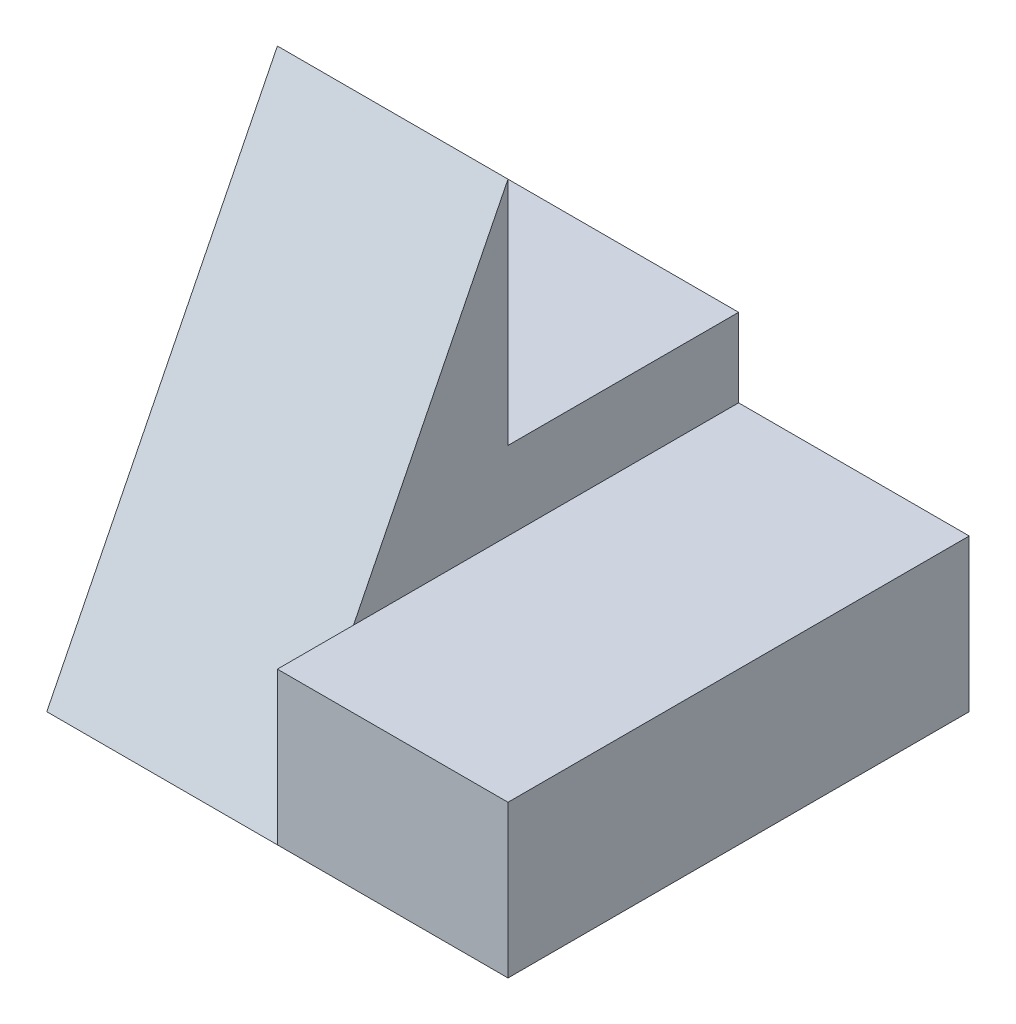
ISO-10303-21;
HEADER;
FILE_DESCRIPTION(('STEP AP214'),'2;1');
FILE_NAME('part.step','',(''),(''),'','','');
FILE_SCHEMA(('AUTOMOTIVE_DESIGN { 1 0 10303 214 1 1 1 1 }'));
ENDSEC;
DATA;
#1=APPLICATION_CONTEXT('core data for automotive mechanical design processes');
#2=APPLICATION_PROTOCOL_DEFINITION('international standard','automotive_design',2000,#1);
#3=PRODUCT_CONTEXT('',#1,'mechanical');
#4=PRODUCT('Part','Part','',(#3));
#5=PRODUCT_RELATED_PRODUCT_CATEGORY('part','',(#4));
#6=PRODUCT_DEFINITION_FORMATION('','',#4);
#7=PRODUCT_DEFINITION_CONTEXT('part definition',#1,'design');
#8=PRODUCT_DEFINITION('design','',#6,#7);
#9=PRODUCT_DEFINITION_SHAPE('','',#8);
#10=(LENGTH_UNIT() NAMED_UNIT(*) SI_UNIT(.MILLI.,.METRE.));
#11=(NAMED_UNIT(*) PLANE_ANGLE_UNIT() SI_UNIT($,.RADIAN.));
#12=(NAMED_UNIT(*) SI_UNIT($,.STERADIAN.) SOLID_ANGLE_UNIT());
#13=UNCERTAINTY_MEASURE_WITH_UNIT(LENGTH_MEASURE(1.E-05),#10,'distance_accuracy_value','');
#14=(GEOMETRIC_REPRESENTATION_CONTEXT(3) GLOBAL_UNCERTAINTY_ASSIGNED_CONTEXT((#13)) GLOBAL_UNIT_ASSIGNED_CONTEXT((#10,
#11,#12)) REPRESENTATION_CONTEXT('',''));
#15=CARTESIAN_POINT('',(0.,0.,0.));
#16=DIRECTION('',(0.,0.,1.));
#17=DIRECTION('',(1.,0.,0.));
#18=AXIS2_PLACEMENT_3D('',#15,#16,#17);
#19=CARTESIAN_POINT('',(0.5,1.,0.));
#20=DIRECTION('',(1.,0.,0.));
#21=DIRECTION('',(0.,0.,-1.));
#22=AXIS2_PLACEMENT_3D('',#19,#20,#21);
#23=PLANE('',#22);
#24=DIRECTION('',(0.,0.,1.));
#25=VECTOR('',#24,1.);
#26=CARTESIAN_POINT('',(0.5,0.33,0.));
#27=LINE('',#26,#25);
#28=CARTESIAN_POINT('',(0.5,0.33,-0.165));
#29=VERTEX_POINT('',#28);
#30=CARTESIAN_POINT('',(0.5,0.33,0.));
#31=VERTEX_POINT('',#30);
#32=EDGE_CURVE('E149',#29,#31,#27,.T.);
#33=ORIENTED_EDGE('',*,*,#32,.F.);
#34=DIRECTION('',(0.,-0.894427190999916,0.447213595499958));
#35=VECTOR('',#34,1.);
#36=CARTESIAN_POINT('',(0.5,0.,0.));
#37=LINE('',#36,#35);
#38=CARTESIAN_POINT('',(0.5,0.,0.));
#39=VERTEX_POINT('',#38);
#40=EDGE_CURVE('E55',#29,#39,#37,.T.);
#41=ORIENTED_EDGE('',*,*,#40,.T.);
#42=DIRECTION('',(0.,-1.,0.));
#43=VECTOR('',#42,1.);
#44=CARTESIAN_POINT('',(0.5,1.,0.));
#45=LINE('',#44,#43);
#46=EDGE_CURVE('E126',#31,#39,#45,.T.);
#47=ORIENTED_EDGE('',*,*,#46,.F.);
#48=EDGE_LOOP('',(#33,#41,#47));
#49=FACE_BOUND('',#48,.T.);
#50=ADVANCED_FACE('F39',(#49),#23,.F.);
#51=CARTESIAN_POINT('',(-2.7900635094611,0.5,-0.5));
#52=DIRECTION('',(0.,-1.,0.));
#53=DIRECTION('',(0.,0.,-1.));
#54=AXIS2_PLACEMENT_3D('',#51,#52,#53);
#55=PLANE('',#54);
#56=DIRECTION('',(0.,0.,1.));
#57=VECTOR('',#56,1.);
#58=CARTESIAN_POINT('',(0.,0.5,-0.5));
#59=LINE('',#58,#57);
#60=CARTESIAN_POINT('',(0.,0.5,-1.));
#61=VERTEX_POINT('',#60);
#62=CARTESIAN_POINT('',(0.,0.5,-0.5));
#63=VERTEX_POINT('',#62);
#64=EDGE_CURVE('E122',#61,#63,#59,.T.);
#65=ORIENTED_EDGE('',*,*,#64,.T.);
#66=DIRECTION('',(1.,0.,0.));
#67=VECTOR('',#66,1.);
#68=CARTESIAN_POINT('',(-2.7900635094611,0.5,-0.5));
#69=LINE('',#68,#67);
#70=CARTESIAN_POINT('',(0.5,0.5,-0.5));
#71=VERTEX_POINT('',#70);
#72=EDGE_CURVE('E107',#63,#71,#69,.T.);
#73=ORIENTED_EDGE('',*,*,#72,.T.);
#74=DIRECTION('',(0.,0.,1.));
#75=VECTOR('',#74,1.);
#76=CARTESIAN_POINT('',(0.5,0.5,-0.5));
#77=LINE('',#76,#75);
#78=CARTESIAN_POINT('',(0.5,0.5,-1.));
#79=VERTEX_POINT('',#78);
#80=EDGE_CURVE('E138',#79,#71,#77,.T.);
#81=ORIENTED_EDGE('',*,*,#80,.F.);
#82=DIRECTION('',(1.,0.,0.));
#83=VECTOR('',#82,1.);
#84=CARTESIAN_POINT('',(-2.7900635094611,0.5,-1.));
#85=LINE('',#84,#83);
#86=EDGE_CURVE('E120',#61,#79,#85,.T.);
#87=ORIENTED_EDGE('',*,*,#86,.F.);
#88=EDGE_LOOP('',(#65,#73,#81,#87));
#89=FACE_BOUND('',#88,.T.);
#90=ADVANCED_FACE('F123',(#89),#55,.F.);
#91=CARTESIAN_POINT('',(-2.7900635094611,1.,-0.5));
#92=DIRECTION('',(0.,0.,1.));
#93=DIRECTION('',(1.,0.,0.));
#94=AXIS2_PLACEMENT_3D('',#91,#92,#93);
#95=PLANE('',#94);
#96=DIRECTION('',(0.,1.,0.));
#97=VECTOR('',#96,1.);
#98=CARTESIAN_POINT('',(0.,1.,-0.5));
#99=LINE('',#98,#97);
#100=CARTESIAN_POINT('',(0.,1.,-0.5));
#101=VERTEX_POINT('',#100);
#102=EDGE_CURVE('E112',#63,#101,#99,.T.);
#103=ORIENTED_EDGE('',*,*,#102,.T.);
#104=DIRECTION('',(1.,0.,0.));
#105=VECTOR('',#104,1.);
#106=CARTESIAN_POINT('',(-2.7900635094611,1.,-0.5));
#107=LINE('',#106,#105);
#108=CARTESIAN_POINT('',(0.5,1.,-0.5));
#109=VERTEX_POINT('',#108);
#110=EDGE_CURVE('E135',#101,#109,#107,.T.);
#111=ORIENTED_EDGE('',*,*,#110,.T.);
#112=DIRECTION('',(0.,1.,0.));
#113=VECTOR('',#112,1.);
#114=CARTESIAN_POINT('',(0.5,1.,-0.5));
#115=LINE('',#114,#113);
#116=EDGE_CURVE('E115',#71,#109,#115,.T.);
#117=ORIENTED_EDGE('',*,*,#116,.F.);
#118=ORIENTED_EDGE('',*,*,#72,.F.);
#119=EDGE_LOOP('',(#103,#111,#117,#118));
#120=FACE_BOUND('',#119,.T.);
#121=ADVANCED_FACE('F109',(#120),#95,.F.);
#122=CARTESIAN_POINT('',(-2.7900635094611,0.,0.));
#123=DIRECTION('',(0.,-0.447213595499958,-0.894427190999916));
#124=DIRECTION('',(0.,0.894427190999916,-0.447213595499958));
#125=AXIS2_PLACEMENT_3D('',#122,#123,#124);
#126=PLANE('',#125);
#127=DIRECTION('',(0.,-0.894427190999916,0.447213595499958));
#128=VECTOR('',#127,1.);
#129=CARTESIAN_POINT('',(0.,0.,0.));
#130=LINE('',#129,#128);
#131=CARTESIAN_POINT('',(0.,0.,0.));
#132=VERTEX_POINT('',#131);
#133=EDGE_CURVE('E128',#101,#132,#130,.T.);
#134=ORIENTED_EDGE('',*,*,#133,.T.);
#135=DIRECTION('',(1.,0.,0.));
#136=VECTOR('',#135,1.);
#137=CARTESIAN_POINT('',(0.,0.,0.));
#138=LINE('',#137,#136);
#139=EDGE_CURVE('E167',#132,#39,#138,.T.);
#140=ORIENTED_EDGE('',*,*,#139,.T.);
#141=ORIENTED_EDGE('',*,*,#40,.F.);
#142=EDGE_CURVE('E207',#109,#29,#37,.T.);
#143=ORIENTED_EDGE('',*,*,#142,.F.);
#144=ORIENTED_EDGE('',*,*,#110,.F.);
#145=EDGE_LOOP('',(#134,#140,#141,#143,#144));
#146=FACE_BOUND('',#145,.T.);
#147=ADVANCED_FACE('F193',(#146),#126,.F.);
#148=CARTESIAN_POINT('',(0.,1.,0.));
#149=DIRECTION('',(0.,0.,-1.));
#150=DIRECTION('',(-1.,0.,0.));
#151=AXIS2_PLACEMENT_3D('',#148,#149,#150);
#152=PLANE('',#151);
#153=DIRECTION('',(-1.,0.,0.));
#154=VECTOR('',#153,1.);
#155=CARTESIAN_POINT('',(4.4150635094611,0.33,0.));
#156=LINE('',#155,#154);
#157=CARTESIAN_POINT('',(1.,0.33,0.));
#158=VERTEX_POINT('',#157);
#159=EDGE_CURVE('E157',#158,#31,#156,.T.);
#160=ORIENTED_EDGE('',*,*,#159,.T.);
#161=ORIENTED_EDGE('',*,*,#46,.T.);
#162=CARTESIAN_POINT('',(1.,0.,0.));
#163=VERTEX_POINT('',#162);
#164=EDGE_CURVE('E166',#39,#163,#138,.T.);
#165=ORIENTED_EDGE('',*,*,#164,.T.);
#166=DIRECTION('',(0.,-1.,0.));
#167=VECTOR('',#166,1.);
#168=CARTESIAN_POINT('',(1.,1.,0.));
#169=LINE('',#168,#167);
#170=EDGE_CURVE('E11',#158,#163,#169,.T.);
#171=ORIENTED_EDGE('',*,*,#170,.F.);
#172=EDGE_LOOP('',(#160,#161,#165,#171));
#173=FACE_BOUND('',#172,.T.);
#174=ADVANCED_FACE('F195',(#173),#152,.F.);
#175=CARTESIAN_POINT('',(1.,1.,0.));
#176=DIRECTION('',(-1.,0.,0.));
#177=DIRECTION('',(0.,0.,1.));
#178=AXIS2_PLACEMENT_3D('',#175,#176,#177);
#179=PLANE('',#178);
#180=DIRECTION('',(0.,0.,1.));
#181=VECTOR('',#180,1.);
#182=CARTESIAN_POINT('',(1.,0.33,0.));
#183=LINE('',#182,#181);
#184=CARTESIAN_POINT('',(1.,0.33,-1.));
#185=VERTEX_POINT('',#184);
#186=EDGE_CURVE('E150',#185,#158,#183,.T.);
#187=ORIENTED_EDGE('',*,*,#186,.T.);
#188=ORIENTED_EDGE('',*,*,#170,.T.);
#189=DIRECTION('',(0.,0.,-1.));
#190=VECTOR('',#189,1.);
#191=CARTESIAN_POINT('',(1.,0.,0.));
#192=LINE('',#191,#190);
#193=CARTESIAN_POINT('',(1.,0.,-1.));
#194=VERTEX_POINT('',#193);
#195=EDGE_CURVE('E170',#163,#194,#192,.T.);
#196=ORIENTED_EDGE('',*,*,#195,.T.);
#197=DIRECTION('',(0.,-1.,0.));
#198=VECTOR('',#197,1.);
#199=CARTESIAN_POINT('',(1.,1.,-1.));
#200=LINE('',#199,#198);
#201=EDGE_CURVE('E48',#185,#194,#200,.T.);
#202=ORIENTED_EDGE('',*,*,#201,.F.);
#203=EDGE_LOOP('',(#187,#188,#196,#202));
#204=FACE_BOUND('',#203,.T.);
#205=ADVANCED_FACE('F187',(#204),#179,.F.);
#206=CARTESIAN_POINT('',(0.,1.,-1.));
#207=DIRECTION('',(0.,0.,1.));
#208=DIRECTION('',(1.,0.,0.));
#209=AXIS2_PLACEMENT_3D('',#206,#207,#208);
#210=PLANE('',#209);
#211=DIRECTION('',(0.,-1.,0.));
#212=VECTOR('',#211,1.);
#213=CARTESIAN_POINT('',(0.,1.,-1.));
#214=LINE('',#213,#212);
#215=CARTESIAN_POINT('',(0.,0.,-1.));
#216=VERTEX_POINT('',#215);
#217=EDGE_CURVE('E63',#61,#216,#214,.T.);
#218=ORIENTED_EDGE('',*,*,#217,.F.);
#219=ORIENTED_EDGE('',*,*,#86,.T.);
#220=DIRECTION('',(0.,-1.,0.));
#221=VECTOR('',#220,1.);
#222=CARTESIAN_POINT('',(0.5,1.,-1.));
#223=LINE('',#222,#221);
#224=CARTESIAN_POINT('',(0.5,0.33,-1.));
#225=VERTEX_POINT('',#224);
#226=EDGE_CURVE('E119',#79,#225,#223,.T.);
#227=ORIENTED_EDGE('',*,*,#226,.T.);
#228=DIRECTION('',(-1.,0.,0.));
#229=VECTOR('',#228,1.);
#230=CARTESIAN_POINT('',(4.4150635094611,0.33,-1.));
#231=LINE('',#230,#229);
#232=EDGE_CURVE('E148',#185,#225,#231,.T.);
#233=ORIENTED_EDGE('',*,*,#232,.F.);
#234=ORIENTED_EDGE('',*,*,#201,.T.);
#235=DIRECTION('',(-1.,0.,0.));
#236=VECTOR('',#235,1.);
#237=CARTESIAN_POINT('',(0.,0.,-1.));
#238=LINE('',#237,#236);
#239=EDGE_CURVE('E174',#194,#216,#238,.T.);
#240=ORIENTED_EDGE('',*,*,#239,.T.);
#241=EDGE_LOOP('',(#218,#219,#227,#233,#234,#240));
#242=FACE_BOUND('',#241,.T.);
#243=ADVANCED_FACE('F182',(#242),#210,.F.);
#244=CARTESIAN_POINT('',(0.,1.,0.));
#245=DIRECTION('',(1.,0.,0.));
#246=DIRECTION('',(0.,0.,-1.));
#247=AXIS2_PLACEMENT_3D('',#244,#245,#246);
#248=PLANE('',#247);
#249=ORIENTED_EDGE('',*,*,#102,.F.);
#250=ORIENTED_EDGE('',*,*,#64,.F.);
#251=ORIENTED_EDGE('',*,*,#217,.T.);
#252=DIRECTION('',(0.,0.,1.));
#253=VECTOR('',#252,1.);
#254=CARTESIAN_POINT('',(0.,0.,0.));
#255=LINE('',#254,#253);
#256=EDGE_CURVE('E161',#216,#132,#255,.T.);
#257=ORIENTED_EDGE('',*,*,#256,.T.);
#258=ORIENTED_EDGE('',*,*,#133,.F.);
#259=EDGE_LOOP('',(#249,#250,#251,#257,#258));
#260=FACE_BOUND('',#259,.T.);
#261=ADVANCED_FACE('F41',(#260),#248,.F.);
#262=CARTESIAN_POINT('',(0.,0.,0.));
#263=DIRECTION('',(0.,-1.,0.));
#264=DIRECTION('',(0.,0.,-1.));
#265=AXIS2_PLACEMENT_3D('',#262,#263,#264);
#266=PLANE('',#265);
#267=ORIENTED_EDGE('',*,*,#256,.F.);
#268=ORIENTED_EDGE('',*,*,#239,.F.);
#269=ORIENTED_EDGE('',*,*,#195,.F.);
#270=ORIENTED_EDGE('',*,*,#164,.F.);
#271=ORIENTED_EDGE('',*,*,#139,.F.);
#272=EDGE_LOOP('',(#267,#268,#269,#270,#271));
#273=FACE_BOUND('',#272,.T.);
#274=ADVANCED_FACE('F191',(#273),#266,.T.);
#275=CARTESIAN_POINT('',(4.4150635094611,0.33,0.));
#276=DIRECTION('',(0.,1.,0.));
#277=DIRECTION('',(0.,0.,1.));
#278=AXIS2_PLACEMENT_3D('',#275,#276,#277);
#279=PLANE('',#278);
#280=ORIENTED_EDGE('',*,*,#186,.F.);
#281=ORIENTED_EDGE('',*,*,#232,.T.);
#282=EDGE_CURVE('E144',#225,#29,#27,.T.);
#283=ORIENTED_EDGE('',*,*,#282,.T.);
#284=ORIENTED_EDGE('',*,*,#32,.T.);
#285=ORIENTED_EDGE('',*,*,#159,.F.);
#286=EDGE_LOOP('',(#280,#281,#283,#284,#285));
#287=FACE_BOUND('',#286,.T.);
#288=ADVANCED_FACE('F200',(#287),#279,.T.);
#289=CARTESIAN_POINT('',(0.5,1.,0.));
#290=DIRECTION('',(-1.,0.,0.));
#291=DIRECTION('',(0.,0.,1.));
#292=AXIS2_PLACEMENT_3D('',#289,#290,#291);
#293=PLANE('',#292);
#294=ORIENTED_EDGE('',*,*,#226,.F.);
#295=ORIENTED_EDGE('',*,*,#80,.T.);
#296=ORIENTED_EDGE('',*,*,#116,.T.);
#297=ORIENTED_EDGE('',*,*,#142,.T.);
#298=ORIENTED_EDGE('',*,*,#282,.F.);
#299=EDGE_LOOP('',(#294,#295,#296,#297,#298));
#300=FACE_BOUND('',#299,.T.);
#301=ADVANCED_FACE('F212',(#300),#293,.F.);
#302=CLOSED_SHELL('',(#50,#90,#121,#147,#174,#205,#243,#261,#274,#288,#301));
#303=MANIFOLD_SOLID_BREP('B2',#302);
#304=ADVANCED_BREP_SHAPE_REPRESENTATION('',(#18,#303),#14);
#305=SHAPE_DEFINITION_REPRESENTATION(#9,#304);
ENDSEC;
END-ISO-10303-21;
